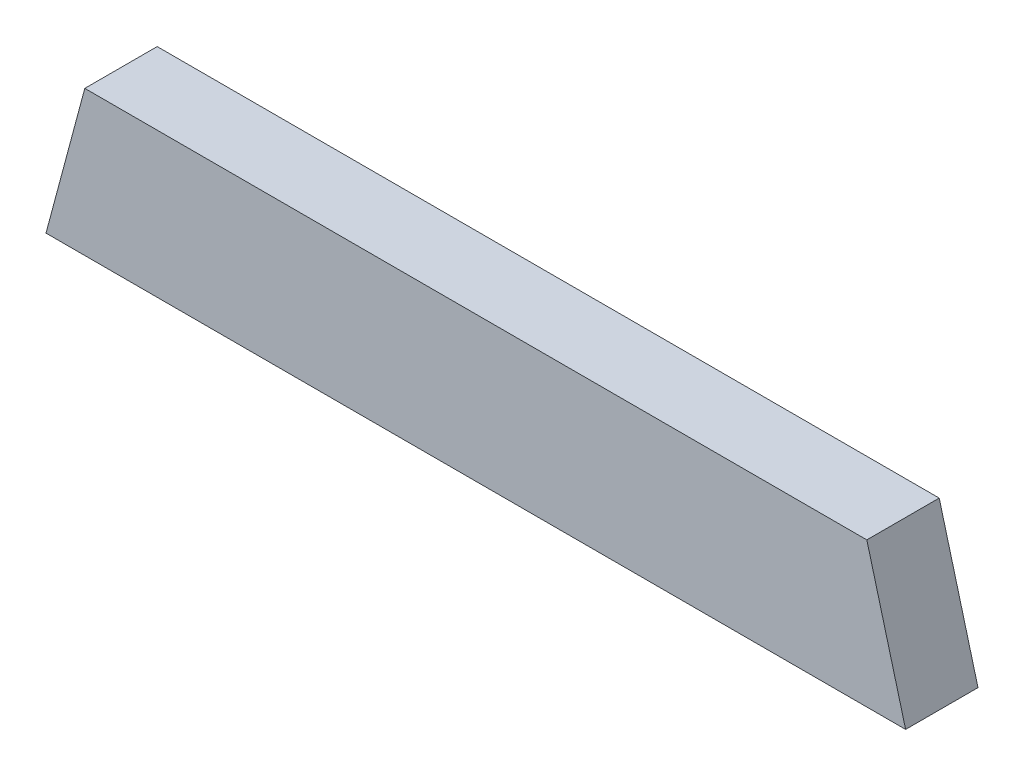
ISO-10303-21;
HEADER;
FILE_DESCRIPTION(('STEP AP214'),'2;1');
FILE_NAME('part.step','',(''),(''),'','','');
FILE_SCHEMA(('AUTOMOTIVE_DESIGN { 1 0 10303 214 1 1 1 1 }'));
ENDSEC;
DATA;
#1=APPLICATION_CONTEXT('core data for automotive mechanical design processes');
#2=APPLICATION_PROTOCOL_DEFINITION('international standard','automotive_design',2000,#1);
#3=PRODUCT_CONTEXT('',#1,'mechanical');
#4=PRODUCT('Part','Part','',(#3));
#5=PRODUCT_RELATED_PRODUCT_CATEGORY('part','',(#4));
#6=PRODUCT_DEFINITION_FORMATION('','',#4);
#7=PRODUCT_DEFINITION_CONTEXT('part definition',#1,'design');
#8=PRODUCT_DEFINITION('design','',#6,#7);
#9=PRODUCT_DEFINITION_SHAPE('','',#8);
#10=(LENGTH_UNIT() NAMED_UNIT(*) SI_UNIT(.MILLI.,.METRE.));
#11=(NAMED_UNIT(*) PLANE_ANGLE_UNIT() SI_UNIT($,.RADIAN.));
#12=(NAMED_UNIT(*) SI_UNIT($,.STERADIAN.) SOLID_ANGLE_UNIT());
#13=UNCERTAINTY_MEASURE_WITH_UNIT(LENGTH_MEASURE(1.E-05),#10,'distance_accuracy_value','');
#14=(GEOMETRIC_REPRESENTATION_CONTEXT(3) GLOBAL_UNCERTAINTY_ASSIGNED_CONTEXT((#13)) GLOBAL_UNIT_ASSIGNED_CONTEXT((#10,
#11,#12)) REPRESENTATION_CONTEXT('',''));
#15=CARTESIAN_POINT('',(0.,0.,0.));
#16=DIRECTION('',(0.,0.,1.));
#17=DIRECTION('',(1.,0.,0.));
#18=AXIS2_PLACEMENT_3D('',#15,#16,#17);
#19=CARTESIAN_POINT('',(0.,0.,50.8));
#20=DIRECTION('',(0.,1.,0.));
#21=DIRECTION('',(0.,0.,1.));
#22=AXIS2_PLACEMENT_3D('',#19,#20,#21);
#23=PLANE('',#22);
#24=DIRECTION('',(1.,0.,0.));
#25=VECTOR('',#24,1.);
#26=CARTESIAN_POINT('',(0.,0.,0.));
#27=LINE('',#26,#25);
#28=CARTESIAN_POINT('',(0.,0.,0.));
#29=VERTEX_POINT('',#28);
#30=CARTESIAN_POINT('',(603.25,0.,0.));
#31=VERTEX_POINT('',#30);
#32=EDGE_CURVE('E109',#29,#31,#27,.T.);
#33=ORIENTED_EDGE('',*,*,#32,.T.);
#34=DIRECTION('',(0.,0.,-1.));
#35=VECTOR('',#34,1.);
#36=CARTESIAN_POINT('',(603.25,0.,50.8));
#37=LINE('',#36,#35);
#38=CARTESIAN_POINT('',(603.25,0.,50.8));
#39=VERTEX_POINT('',#38);
#40=EDGE_CURVE('E11',#39,#31,#37,.T.);
#41=ORIENTED_EDGE('',*,*,#40,.F.);
#42=DIRECTION('',(1.,0.,0.));
#43=VECTOR('',#42,1.);
#44=CARTESIAN_POINT('',(0.,0.,50.8));
#45=LINE('',#44,#43);
#46=CARTESIAN_POINT('',(0.,0.,50.8));
#47=VERTEX_POINT('',#46);
#48=EDGE_CURVE('E91',#47,#39,#45,.T.);
#49=ORIENTED_EDGE('',*,*,#48,.F.);
#50=DIRECTION('',(0.,0.,-1.));
#51=VECTOR('',#50,1.);
#52=CARTESIAN_POINT('',(0.,0.,50.8));
#53=LINE('',#52,#51);
#54=EDGE_CURVE('E58',#47,#29,#53,.T.);
#55=ORIENTED_EDGE('',*,*,#54,.T.);
#56=EDGE_LOOP('',(#33,#41,#49,#55));
#57=FACE_BOUND('',#56,.T.);
#58=ADVANCED_FACE('F41',(#57),#23,.F.);
#59=CARTESIAN_POINT('',(562.839912416481,150.8125,50.8));
#60=DIRECTION('',(-0.965925826289068,-0.258819045102521,0.));
#61=DIRECTION('',(0.258819045102521,-0.965925826289068,0.));
#62=AXIS2_PLACEMENT_3D('',#59,#60,#61);
#63=PLANE('',#62);
#64=DIRECTION('',(-0.258819045102521,0.965925826289068,0.));
#65=VECTOR('',#64,1.);
#66=CARTESIAN_POINT('',(562.839912416481,150.8125,0.));
#67=LINE('',#66,#65);
#68=CARTESIAN_POINT('',(576.026362048998,101.6,0.));
#69=VERTEX_POINT('',#68);
#70=EDGE_CURVE('E97',#31,#69,#67,.T.);
#71=ORIENTED_EDGE('',*,*,#70,.T.);
#72=DIRECTION('',(0.,0.,-1.));
#73=VECTOR('',#72,1.);
#74=CARTESIAN_POINT('',(576.026362048998,101.6,50.8));
#75=LINE('',#74,#73);
#76=CARTESIAN_POINT('',(576.026362048998,101.6,50.8));
#77=VERTEX_POINT('',#76);
#78=EDGE_CURVE('E50',#77,#69,#75,.T.);
#79=ORIENTED_EDGE('',*,*,#78,.F.);
#80=DIRECTION('',(-0.258819045102521,0.965925826289068,0.));
#81=VECTOR('',#80,1.);
#82=CARTESIAN_POINT('',(562.839912416481,150.8125,50.8));
#83=LINE('',#82,#81);
#84=EDGE_CURVE('E83',#39,#77,#83,.T.);
#85=ORIENTED_EDGE('',*,*,#84,.F.);
#86=ORIENTED_EDGE('',*,*,#40,.T.);
#87=EDGE_LOOP('',(#71,#79,#85,#86));
#88=FACE_BOUND('',#87,.T.);
#89=ADVANCED_FACE('F96',(#88),#63,.F.);
#90=CARTESIAN_POINT('',(0.,101.6,50.8));
#91=DIRECTION('',(0.,1.,0.));
#92=DIRECTION('',(0.,0.,1.));
#93=AXIS2_PLACEMENT_3D('',#90,#91,#92);
#94=PLANE('',#93);
#95=DIRECTION('',(1.,0.,0.));
#96=VECTOR('',#95,1.);
#97=CARTESIAN_POINT('',(0.,101.6,0.));
#98=LINE('',#97,#96);
#99=CARTESIAN_POINT('',(27.2236379510021,101.6,0.));
#100=VERTEX_POINT('',#99);
#101=EDGE_CURVE('E114',#100,#69,#98,.T.);
#102=ORIENTED_EDGE('',*,*,#101,.F.);
#103=DIRECTION('',(0.,0.,-1.));
#104=VECTOR('',#103,1.);
#105=CARTESIAN_POINT('',(27.2236379510021,101.6,50.8));
#106=LINE('',#105,#104);
#107=CARTESIAN_POINT('',(27.2236379510021,101.6,50.8));
#108=VERTEX_POINT('',#107);
#109=EDGE_CURVE('E72',#108,#100,#106,.T.);
#110=ORIENTED_EDGE('',*,*,#109,.F.);
#111=DIRECTION('',(1.,0.,0.));
#112=VECTOR('',#111,1.);
#113=CARTESIAN_POINT('',(0.,101.6,50.8));
#114=LINE('',#113,#112);
#115=EDGE_CURVE('E90',#108,#77,#114,.T.);
#116=ORIENTED_EDGE('',*,*,#115,.T.);
#117=ORIENTED_EDGE('',*,*,#78,.T.);
#118=EDGE_LOOP('',(#102,#110,#116,#117));
#119=FACE_BOUND('',#118,.T.);
#120=ADVANCED_FACE('F101',(#119),#94,.T.);
#121=CARTESIAN_POINT('',(0.,0.,50.8));
#122=DIRECTION('',(-0.965925826289068,0.258819045102521,0.));
#123=DIRECTION('',(-0.258819045102521,-0.965925826289068,0.));
#124=AXIS2_PLACEMENT_3D('',#121,#122,#123);
#125=PLANE('',#124);
#126=DIRECTION('',(0.258819045102521,0.965925826289068,0.));
#127=VECTOR('',#126,1.);
#128=CARTESIAN_POINT('',(0.,0.,0.));
#129=LINE('',#128,#127);
#130=EDGE_CURVE('E117',#29,#100,#129,.T.);
#131=ORIENTED_EDGE('',*,*,#130,.F.);
#132=ORIENTED_EDGE('',*,*,#54,.F.);
#133=DIRECTION('',(0.258819045102521,0.965925826289068,0.));
#134=VECTOR('',#133,1.);
#135=CARTESIAN_POINT('',(0.,0.,50.8));
#136=LINE('',#135,#134);
#137=EDGE_CURVE('E103',#47,#108,#136,.T.);
#138=ORIENTED_EDGE('',*,*,#137,.T.);
#139=ORIENTED_EDGE('',*,*,#109,.T.);
#140=EDGE_LOOP('',(#131,#132,#138,#139));
#141=FACE_BOUND('',#140,.T.);
#142=ADVANCED_FACE('F127',(#141),#125,.T.);
#143=CARTESIAN_POINT('',(0.,0.,50.8));
#144=DIRECTION('',(0.,0.,1.));
#145=DIRECTION('',(1.,0.,0.));
#146=AXIS2_PLACEMENT_3D('',#143,#144,#145);
#147=PLANE('',#146);
#148=ORIENTED_EDGE('',*,*,#48,.T.);
#149=ORIENTED_EDGE('',*,*,#84,.T.);
#150=ORIENTED_EDGE('',*,*,#115,.F.);
#151=ORIENTED_EDGE('',*,*,#137,.F.);
#152=EDGE_LOOP('',(#148,#149,#150,#151));
#153=FACE_BOUND('',#152,.T.);
#154=ADVANCED_FACE('F87',(#153),#147,.T.);
#155=CARTESIAN_POINT('',(0.,0.,0.));
#156=DIRECTION('',(0.,0.,1.));
#157=DIRECTION('',(1.,0.,0.));
#158=AXIS2_PLACEMENT_3D('',#155,#156,#157);
#159=PLANE('',#158);
#160=ORIENTED_EDGE('',*,*,#32,.F.);
#161=ORIENTED_EDGE('',*,*,#130,.T.);
#162=ORIENTED_EDGE('',*,*,#101,.T.);
#163=ORIENTED_EDGE('',*,*,#70,.F.);
#164=EDGE_LOOP('',(#160,#161,#162,#163));
#165=FACE_BOUND('',#164,.T.);
#166=ADVANCED_FACE('F126',(#165),#159,.F.);
#167=CLOSED_SHELL('',(#58,#89,#120,#142,#154,#166));
#168=MANIFOLD_SOLID_BREP('B2',#167);
#169=ADVANCED_BREP_SHAPE_REPRESENTATION('',(#18,#168),#14);
#170=SHAPE_DEFINITION_REPRESENTATION(#9,#169);
ENDSEC;
END-ISO-10303-21;
